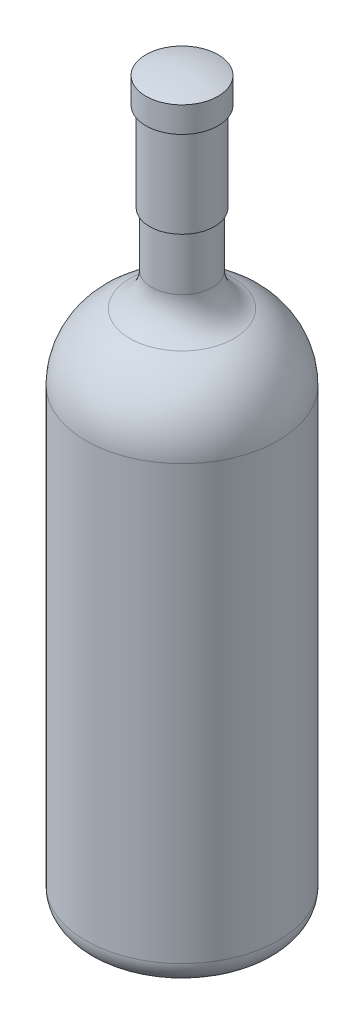
ISO-10303-21;
HEADER;
FILE_DESCRIPTION(('STEP AP214'),'2;1');
FILE_NAME('part.step','',(''),(''),'','','');
FILE_SCHEMA(('AUTOMOTIVE_DESIGN { 1 0 10303 214 1 1 1 1 }'));
ENDSEC;
DATA;
#1=APPLICATION_CONTEXT('core data for automotive mechanical design processes');
#2=APPLICATION_PROTOCOL_DEFINITION('international standard','automotive_design',2000,#1);
#3=PRODUCT_CONTEXT('',#1,'mechanical');
#4=PRODUCT('Part','Part','',(#3));
#5=PRODUCT_RELATED_PRODUCT_CATEGORY('part','',(#4));
#6=PRODUCT_DEFINITION_FORMATION('','',#4);
#7=PRODUCT_DEFINITION_CONTEXT('part definition',#1,'design');
#8=PRODUCT_DEFINITION('design','',#6,#7);
#9=PRODUCT_DEFINITION_SHAPE('','',#8);
#10=(LENGTH_UNIT() NAMED_UNIT(*) SI_UNIT(.MILLI.,.METRE.));
#11=(NAMED_UNIT(*) PLANE_ANGLE_UNIT() SI_UNIT($,.RADIAN.));
#12=(NAMED_UNIT(*) SI_UNIT($,.STERADIAN.) SOLID_ANGLE_UNIT());
#13=UNCERTAINTY_MEASURE_WITH_UNIT(LENGTH_MEASURE(1.E-05),#10,'distance_accuracy_value','');
#14=(GEOMETRIC_REPRESENTATION_CONTEXT(3) GLOBAL_UNCERTAINTY_ASSIGNED_CONTEXT((#13)) GLOBAL_UNIT_ASSIGNED_CONTEXT((#10,
#11,#12)) REPRESENTATION_CONTEXT('',''));
#15=CARTESIAN_POINT('',(0.,0.,0.));
#16=DIRECTION('',(0.,0.,1.));
#17=DIRECTION('',(1.,0.,0.));
#18=AXIS2_PLACEMENT_3D('',#15,#16,#17);
#19=CARTESIAN_POINT('',(0.,25.,0.));
#20=CARTESIAN_POINT('',(15.4953746740138,25.,0.));
#21=CARTESIAN_POINT('',(19.2023142455503,0.,0.));
#22=CARTESIAN_POINT('',(29.8048549239684,0.,0.));
#23=CARTESIAN_POINT('',(29.9098305742498,0.,0.));
#24=CARTESIAN_POINT('',(30.0148062245311,0.,0.));
#25=B_SPLINE_CURVE_WITH_KNOTS('',3,(#19,#20,#21,#22,#23,#24),.UNSPECIFIED.,.F.,.F.,(4,2,4),(0.,
1.,1.01),.UNSPECIFIED.);
#26=CARTESIAN_POINT('',(0.,0.,0.));
#27=DIRECTION('',(0.,-1.,0.));
#28=AXIS1_PLACEMENT('',#26,#27);
#29=SURFACE_OF_REVOLUTION('',#25,#28);
#30=OFFSET_SURFACE('',#29,2.2,.F.);
#31=CARTESIAN_POINT('',(0.,2.2,0.));
#32=DIRECTION('',(0.,-1.,0.));
#33=DIRECTION('',(0.,0.,-1.));
#34=AXIS2_PLACEMENT_3D('',#31,#32,#33);
#35=CIRCLE('',#34,29.7349489726552);
#36=CARTESIAN_POINT('',(0.,2.2,-29.7349489726552));
#37=VERTEX_POINT('',#36);
#38=EDGE_CURVE('E78',#37,#37,#35,.T.);
#39=ORIENTED_EDGE('',*,*,#38,.T.);
#40=EDGE_LOOP('',(#39));
#41=FACE_BOUND('',#40,.T.);
#42=CARTESIAN_POINT('',(0.,27.2,0.));
#43=VERTEX_POINT('',#42);
#44=VERTEX_LOOP('',#43);
#45=FACE_BOUND('',#44,.T.);
#46=ADVANCED_FACE('F46',(#41,#45),#30,.F.);
#47=CARTESIAN_POINT('',(0.,9.9954953628941,0.));
#48=DIRECTION('',(0.,-1.,0.));
#49=DIRECTION('',(0.,0.,-1.));
#50=AXIS2_PLACEMENT_3D('',#47,#48,#49);
#51=TOROIDAL_SURFACE('',#50,30.,7.8);
#52=CARTESIAN_POINT('',(0.,9.9954953628941,0.));
#53=DIRECTION('',(0.,-1.,0.));
#54=DIRECTION('',(0.,0.,-1.));
#55=AXIS2_PLACEMENT_3D('',#52,#53,#54);
#56=CIRCLE('',#55,37.8);
#57=CARTESIAN_POINT('',(0.,9.9954953628941,-37.8));
#58=VERTEX_POINT('',#57);
#59=EDGE_CURVE('E99',#58,#58,#56,.T.);
#60=ORIENTED_EDGE('',*,*,#59,.T.);
#61=EDGE_LOOP('',(#60));
#62=FACE_BOUND('',#61,.T.);
#63=ORIENTED_EDGE('',*,*,#38,.F.);
#64=EDGE_LOOP('',(#63));
#65=FACE_BOUND('',#64,.T.);
#66=ADVANCED_FACE('F57',(#62,#65),#51,.T.);
#67=CARTESIAN_POINT('',(0.,0.,0.));
#68=DIRECTION('',(0.,-1.,0.));
#69=DIRECTION('',(0.,0.,-1.));
#70=AXIS2_PLACEMENT_3D('',#67,#68,#69);
#71=CYLINDRICAL_SURFACE('',#70,37.8);
#72=CARTESIAN_POINT('',(0.,190.104348142246,0.));
#73=DIRECTION('',(0.,-1.,0.));
#74=DIRECTION('',(0.,0.,-1.));
#75=AXIS2_PLACEMENT_3D('',#72,#73,#74);
#76=CIRCLE('',#75,37.8);
#77=CARTESIAN_POINT('',(0.,190.104348142246,-37.8));
#78=VERTEX_POINT('',#77);
#79=EDGE_CURVE('E97',#78,#78,#76,.T.);
#80=ORIENTED_EDGE('',*,*,#79,.T.);
#81=EDGE_LOOP('',(#80));
#82=FACE_BOUND('',#81,.T.);
#83=ORIENTED_EDGE('',*,*,#59,.F.);
#84=EDGE_LOOP('',(#83));
#85=FACE_BOUND('',#84,.T.);
#86=ADVANCED_FACE('F63',(#82,#85),#71,.T.);
#87=CARTESIAN_POINT('',(0.,190.104348142246,0.));
#88=DIRECTION('',(0.,-1.,0.));
#89=DIRECTION('',(0.,0.,-1.));
#90=AXIS2_PLACEMENT_3D('',#87,#88,#89);
#91=DEGENERATE_TOROIDAL_SURFACE('',#90,9.99999999999997,27.8,.T.);
#92=CARTESIAN_POINT('',(0.,215.716061801102,0.));
#93=DIRECTION('',(0.,-1.,0.));
#94=DIRECTION('',(0.,0.,-1.));
#95=AXIS2_PLACEMENT_3D('',#92,#93,#94);
#96=CIRCLE('',#95,20.8111111111111);
#97=CARTESIAN_POINT('',(0.,215.716061801102,-20.8111111111111));
#98=VERTEX_POINT('',#97);
#99=EDGE_CURVE('E88',#98,#98,#96,.T.);
#100=ORIENTED_EDGE('',*,*,#99,.T.);
#101=EDGE_LOOP('',(#100));
#102=FACE_BOUND('',#101,.T.);
#103=ORIENTED_EDGE('',*,*,#79,.F.);
#104=EDGE_LOOP('',(#103));
#105=FACE_BOUND('',#104,.T.);
#106=ADVANCED_FACE('F106',(#102,#105),#91,.T.);
#107=CARTESIAN_POINT('',(0.,231.562158021689,0.));
#108=DIRECTION('',(0.,-1.,0.));
#109=DIRECTION('',(0.,0.,-1.));
#110=AXIS2_PLACEMENT_3D('',#107,#108,#109);
#111=TOROIDAL_SURFACE('',#110,27.5,17.2);
#112=CARTESIAN_POINT('',(0.,231.562158021689,0.));
#113=DIRECTION('',(0.,-1.,0.));
#114=DIRECTION('',(0.,0.,-1.));
#115=AXIS2_PLACEMENT_3D('',#112,#113,#114);
#116=CIRCLE('',#115,10.3);
#117=CARTESIAN_POINT('',(0.,231.562158021689,-10.3));
#118=VERTEX_POINT('',#117);
#119=EDGE_CURVE('E84',#118,#118,#116,.F.);
#120=ORIENTED_EDGE('',*,*,#119,.F.);
#121=EDGE_LOOP('',(#120));
#122=FACE_BOUND('',#121,.T.);
#123=ORIENTED_EDGE('',*,*,#99,.F.);
#124=EDGE_LOOP('',(#123));
#125=FACE_BOUND('',#124,.T.);
#126=ADVANCED_FACE('F69',(#122,#125),#111,.F.);
#127=CARTESIAN_POINT('',(0.,0.,0.));
#128=DIRECTION('',(0.,-1.,0.));
#129=DIRECTION('',(0.,0.,-1.));
#130=AXIS2_PLACEMENT_3D('',#127,#128,#129);
#131=CYLINDRICAL_SURFACE('',#130,10.3);
#132=CARTESIAN_POINT('',(0.,236.279188337744,0.));
#133=DIRECTION('',(0.,1.,0.));
#134=DIRECTION('',(0.,0.,1.));
#135=AXIS2_PLACEMENT_3D('',#132,#133,#134);
#136=CIRCLE('',#135,10.3);
#137=CARTESIAN_POINT('',(0.,236.279188337744,10.3));
#138=VERTEX_POINT('',#137);
#139=EDGE_CURVE('E95',#138,#138,#136,.T.);
#140=ORIENTED_EDGE('',*,*,#139,.F.);
#141=EDGE_LOOP('',(#140));
#142=FACE_BOUND('',#141,.T.);
#143=ORIENTED_EDGE('',*,*,#119,.T.);
#144=EDGE_LOOP('',(#143));
#145=FACE_BOUND('',#144,.T.);
#146=ADVANCED_FACE('F117',(#142,#145),#131,.T.);
#147=CARTESIAN_POINT('',(0.,236.279188337744,0.));
#148=DIRECTION('',(0.,1.,0.));
#149=DIRECTION('',(0.,0.,1.));
#150=AXIS2_PLACEMENT_3D('',#147,#148,#149);
#151=CONICAL_SURFACE('',#150,10.3,0.471238898038469);
#152=CARTESIAN_POINT('',(0.,236.052193087874,0.));
#153=DIRECTION('',(0.,-1.,0.));
#154=DIRECTION('',(0.,0.,-1.));
#155=AXIS2_PLACEMENT_3D('',#152,#153,#154);
#156=CIRCLE('',#155,10.184340143277);
#157=CARTESIAN_POINT('',(0.,236.052193087874,-10.184340143277));
#158=VERTEX_POINT('',#157);
#159=EDGE_CURVE('E13',#158,#158,#156,.T.);
#160=ORIENTED_EDGE('',*,*,#159,.T.);
#161=EDGE_LOOP('',(#160));
#162=FACE_BOUND('',#161,.T.);
#163=ORIENTED_EDGE('',*,*,#139,.T.);
#164=EDGE_LOOP('',(#163));
#165=FACE_BOUND('',#164,.T.);
#166=ADVANCED_FACE('F124',(#162,#165),#151,.F.);
#167=CARTESIAN_POINT('',(0.,235.779188337744,0.));
#168=DIRECTION('',(0.,1.,0.));
#169=DIRECTION('',(0.,0.,1.));
#170=AXIS2_PLACEMENT_3D('',#167,#168,#169);
#171=PLANE('',#170);
#172=CARTESIAN_POINT('',(0.,235.779188337744,0.));
#173=DIRECTION('',(0.,1.,0.));
#174=DIRECTION('',(0.,0.,1.));
#175=AXIS2_PLACEMENT_3D('',#172,#173,#174);
#176=CIRCLE('',#175,9.73883688118282);
#177=CARTESIAN_POINT('',(0.,235.779188337744,9.73883688118282));
#178=VERTEX_POINT('',#177);
#179=EDGE_CURVE('E53',#178,#178,#176,.T.);
#180=ORIENTED_EDGE('',*,*,#179,.T.);
#181=EDGE_LOOP('',(#180));
#182=FACE_BOUND('',#181,.T.);
#183=ADVANCED_FACE('F129',(#182),#171,.T.);
#184=CARTESIAN_POINT('',(0.,236.279188337744,0.));
#185=DIRECTION('',(0.,1.,0.));
#186=DIRECTION('',(0.,0.,1.));
#187=AXIS2_PLACEMENT_3D('',#184,#185,#186);
#188=TOROIDAL_SURFACE('',#187,9.73883688118282,0.5);
#189=ORIENTED_EDGE('',*,*,#159,.F.);
#190=EDGE_LOOP('',(#189));
#191=FACE_BOUND('',#190,.T.);
#192=ORIENTED_EDGE('',*,*,#179,.F.);
#193=EDGE_LOOP('',(#192));
#194=FACE_BOUND('',#193,.T.);
#195=ADVANCED_FACE('F48',(#191,#194),#188,.F.);
#196=CLOSED_SHELL('',(#46,#66,#86,#106,#126,#146,#166,#183,#195));
#197=MANIFOLD_SOLID_BREP('B2',#196);
#198=CARTESIAN_POINT('',(0.,254.,0.));
#199=DIRECTION('',(0.,-1.,0.));
#200=DIRECTION('',(1.,0.,0.));
#201=AXIS2_PLACEMENT_3D('',#198,#199,#200);
#202=SPHERICAL_SURFACE('',#201,50.);
#203=CARTESIAN_POINT('',(0.,301.696960070847,0.));
#204=DIRECTION('',(0.,-1.,0.));
#205=DIRECTION('',(0.,0.,-1.));
#206=AXIS2_PLACEMENT_3D('',#203,#204,#205);
#207=CIRCLE('',#206,15.);
#208=CARTESIAN_POINT('',(0.,301.696960070847,-15.));
#209=VERTEX_POINT('',#208);
#210=EDGE_CURVE('E45',#209,#209,#207,.T.);
#211=ORIENTED_EDGE('',*,*,#210,.F.);
#212=EDGE_LOOP('',(#211));
#213=FACE_BOUND('',#212,.T.);
#214=ADVANCED_FACE('F202',(#213),#202,.T.);
#215=CARTESIAN_POINT('',(0.,0.,0.));
#216=DIRECTION('',(0.,-1.,0.));
#217=DIRECTION('',(0.,0.,-1.));
#218=AXIS2_PLACEMENT_3D('',#215,#216,#217);
#219=CYLINDRICAL_SURFACE('',#218,15.);
#220=ORIENTED_EDGE('',*,*,#210,.T.);
#221=EDGE_LOOP('',(#220));
#222=FACE_BOUND('',#221,.T.);
#223=CARTESIAN_POINT('',(0.,291.032263350094,0.));
#224=DIRECTION('',(0.,-1.,0.));
#225=DIRECTION('',(0.,0.,-1.));
#226=AXIS2_PLACEMENT_3D('',#223,#224,#225);
#227=CIRCLE('',#226,15.);
#228=CARTESIAN_POINT('',(0.,291.032263350094,-15.));
#229=VERTEX_POINT('',#228);
#230=EDGE_CURVE('E208',#229,#229,#227,.T.);
#231=ORIENTED_EDGE('',*,*,#230,.F.);
#232=EDGE_LOOP('',(#231));
#233=FACE_BOUND('',#232,.T.);
#234=ADVANCED_FACE('F244',(#222,#233),#219,.T.);
#235=CARTESIAN_POINT('',(0.,290.,0.));
#236=DIRECTION('',(0.,1.,0.));
#237=DIRECTION('',(0.,0.,1.));
#238=AXIS2_PLACEMENT_3D('',#235,#236,#237);
#239=CONICAL_SURFACE('',#238,13.4982347343008,0.968599541335774);
#240=ORIENTED_EDGE('',*,*,#230,.T.);
#241=EDGE_LOOP('',(#240));
#242=FACE_BOUND('',#241,.T.);
#243=CARTESIAN_POINT('',(0.,290.,0.));
#244=DIRECTION('',(0.,-1.,0.));
#245=DIRECTION('',(0.,0.,-1.));
#246=AXIS2_PLACEMENT_3D('',#243,#244,#245);
#247=CIRCLE('',#246,13.4982347343008);
#248=CARTESIAN_POINT('',(0.,290.,-13.4982347343008));
#249=VERTEX_POINT('',#248);
#250=EDGE_CURVE('E212',#249,#249,#247,.T.);
#251=ORIENTED_EDGE('',*,*,#250,.F.);
#252=EDGE_LOOP('',(#251));
#253=FACE_BOUND('',#252,.T.);
#254=ADVANCED_FACE('F249',(#242,#253),#239,.T.);
#255=CARTESIAN_POINT('',(0.,0.,0.));
#256=DIRECTION('',(0.,-1.,0.));
#257=DIRECTION('',(0.,0.,-1.));
#258=AXIS2_PLACEMENT_3D('',#255,#256,#257);
#259=CYLINDRICAL_SURFACE('',#258,13.4982347343008);
#260=ORIENTED_EDGE('',*,*,#250,.T.);
#261=EDGE_LOOP('',(#260));
#262=FACE_BOUND('',#261,.T.);
#263=CARTESIAN_POINT('',(0.,254.,0.));
#264=DIRECTION('',(0.,-1.,0.));
#265=DIRECTION('',(0.,0.,-1.));
#266=AXIS2_PLACEMENT_3D('',#263,#264,#265);
#267=CIRCLE('',#266,13.4982347343008);
#268=CARTESIAN_POINT('',(0.,254.,-13.4982347343008));
#269=VERTEX_POINT('',#268);
#270=EDGE_CURVE('E216',#269,#269,#267,.T.);
#271=ORIENTED_EDGE('',*,*,#270,.F.);
#272=EDGE_LOOP('',(#271));
#273=FACE_BOUND('',#272,.T.);
#274=ADVANCED_FACE('F240',(#262,#273),#259,.T.);
#275=CARTESIAN_POINT('',(13.4982347343008,254.,0.));
#276=DIRECTION('',(0.,-1.,0.));
#277=DIRECTION('',(0.,0.,-1.));
#278=AXIS2_PLACEMENT_3D('',#275,#276,#277);
#279=PLANE('',#278);
#280=ORIENTED_EDGE('',*,*,#270,.T.);
#281=EDGE_LOOP('',(#280));
#282=FACE_BOUND('',#281,.T.);
#283=CARTESIAN_POINT('',(0.,254.,0.));
#284=DIRECTION('',(0.,-1.,0.));
#285=DIRECTION('',(0.,0.,-1.));
#286=AXIS2_PLACEMENT_3D('',#283,#284,#285);
#287=CIRCLE('',#286,12.5);
#288=CARTESIAN_POINT('',(0.,254.,-12.5));
#289=VERTEX_POINT('',#288);
#290=EDGE_CURVE('E221',#289,#289,#287,.T.);
#291=ORIENTED_EDGE('',*,*,#290,.F.);
#292=EDGE_LOOP('',(#291));
#293=FACE_BOUND('',#292,.T.);
#294=ADVANCED_FACE('F232',(#282,#293),#279,.T.);
#295=CARTESIAN_POINT('',(0.,0.,0.));
#296=DIRECTION('',(0.,-1.,0.));
#297=DIRECTION('',(0.,0.,-1.));
#298=AXIS2_PLACEMENT_3D('',#295,#296,#297);
#299=CYLINDRICAL_SURFACE('',#298,12.5);
#300=ORIENTED_EDGE('',*,*,#290,.T.);
#301=EDGE_LOOP('',(#300));
#302=FACE_BOUND('',#301,.T.);
#303=CARTESIAN_POINT('',(0.,300.,0.));
#304=DIRECTION('',(0.,-1.,0.));
#305=DIRECTION('',(0.,0.,-1.));
#306=AXIS2_PLACEMENT_3D('',#303,#304,#305);
#307=CIRCLE('',#306,12.5);
#308=CARTESIAN_POINT('',(0.,300.,-12.5));
#309=VERTEX_POINT('',#308);
#310=EDGE_CURVE('E224',#309,#309,#307,.T.);
#311=ORIENTED_EDGE('',*,*,#310,.F.);
#312=EDGE_LOOP('',(#311));
#313=FACE_BOUND('',#312,.T.);
#314=ADVANCED_FACE('F230',(#302,#313),#299,.F.);
#315=CARTESIAN_POINT('',(12.5,300.,0.));
#316=DIRECTION('',(0.,-1.,0.));
#317=DIRECTION('',(0.,0.,-1.));
#318=AXIS2_PLACEMENT_3D('',#315,#316,#317);
#319=PLANE('',#318);
#320=ORIENTED_EDGE('',*,*,#310,.T.);
#321=EDGE_LOOP('',(#320));
#322=FACE_BOUND('',#321,.T.);
#323=ADVANCED_FACE('F228',(#322),#319,.T.);
#324=CLOSED_SHELL('',(#214,#234,#254,#274,#294,#314,#323));
#325=MANIFOLD_SOLID_BREP('B7',#324);
#326=CARTESIAN_POINT('',(12.5,300.,0.));
#327=DIRECTION('',(0.,1.,0.));
#328=DIRECTION('',(0.,0.,1.));
#329=AXIS2_PLACEMENT_3D('',#326,#327,#328);
#330=PLANE('',#329);
#331=CARTESIAN_POINT('',(0.,300.,0.));
#332=DIRECTION('',(0.,-1.,0.));
#333=DIRECTION('',(0.,0.,-1.));
#334=AXIS2_PLACEMENT_3D('',#331,#332,#333);
#335=CIRCLE('',#334,12.5);
#336=CARTESIAN_POINT('',(0.,300.,-12.5));
#337=VERTEX_POINT('',#336);
#338=EDGE_CURVE('E376',#337,#337,#335,.T.);
#339=ORIENTED_EDGE('',*,*,#338,.F.);
#340=EDGE_LOOP('',(#339));
#341=FACE_BOUND('',#340,.T.);
#342=CARTESIAN_POINT('',(0.,300.,0.));
#343=DIRECTION('',(0.,1.,0.));
#344=DIRECTION('',(0.,0.,1.));
#345=AXIS2_PLACEMENT_3D('',#342,#343,#344);
#346=CIRCLE('',#345,10.5);
#347=CARTESIAN_POINT('',(0.,300.,10.5));
#348=VERTEX_POINT('',#347);
#349=EDGE_CURVE('E412',#348,#348,#346,.F.);
#350=ORIENTED_EDGE('',*,*,#349,.T.);
#351=EDGE_LOOP('',(#350));
#352=FACE_BOUND('',#351,.T.);
#353=ADVANCED_FACE('F302',(#341,#352),#330,.T.);
#354=CARTESIAN_POINT('',(0.,25.,0.));
#355=CARTESIAN_POINT('',(15.4953746740138,25.,0.));
#356=CARTESIAN_POINT('',(19.2023142455503,0.,0.));
#357=CARTESIAN_POINT('',(29.699879273687,0.,0.));
#358=CARTESIAN_POINT('',(29.8048549239684,0.,0.));
#359=CARTESIAN_POINT('',(29.9098305742498,0.,0.));
#360=CARTESIAN_POINT('',(30.0148062245311,0.,0.));
#361=B_SPLINE_CURVE_WITH_KNOTS('',3,(#354,#355,#356,#357,#358,#359,#360),.UNSPECIFIED.,.F.,.F.,
(4,3,4),(0.,1.,1.01),.UNSPECIFIED.);
#362=CARTESIAN_POINT('',(0.,0.,0.));
#363=DIRECTION('',(0.,-1.,0.));
#364=AXIS1_PLACEMENT('',#362,#363);
#365=SURFACE_OF_REVOLUTION('',#361,#364);
#366=CARTESIAN_POINT('',(0.,0.,0.));
#367=DIRECTION('',(0.,-1.,0.));
#368=DIRECTION('',(0.,0.,-1.));
#369=AXIS2_PLACEMENT_3D('',#366,#367,#368);
#370=CIRCLE('',#369,29.699879273687);
#371=CARTESIAN_POINT('',(0.,0.,-29.699879273687));
#372=VERTEX_POINT('',#371);
#373=EDGE_CURVE('E368',#372,#372,#370,.T.);
#374=ORIENTED_EDGE('',*,*,#373,.T.);
#375=EDGE_LOOP('',(#374));
#376=FACE_BOUND('',#375,.T.);
#377=CARTESIAN_POINT('',(0.,25.,0.));
#378=VERTEX_POINT('',#377);
#379=VERTEX_LOOP('',#378);
#380=FACE_BOUND('',#379,.T.);
#381=ADVANCED_FACE('F334',(#376,#380),#365,.F.);
#382=CARTESIAN_POINT('',(0.,9.9954953628941,0.));
#383=DIRECTION('',(0.,-1.,0.));
#384=DIRECTION('',(0.,0.,-1.));
#385=AXIS2_PLACEMENT_3D('',#382,#383,#384);
#386=TOROIDAL_SURFACE('',#385,30.,9.99999999999999);
#387=CARTESIAN_POINT('',(0.,9.9954953628941,0.));
#388=DIRECTION('',(0.,-1.,0.));
#389=DIRECTION('',(0.,0.,-1.));
#390=AXIS2_PLACEMENT_3D('',#387,#388,#389);
#391=CIRCLE('',#390,40.);
#392=CARTESIAN_POINT('',(0.,9.9954953628941,-40.));
#393=VERTEX_POINT('',#392);
#394=EDGE_CURVE('E365',#393,#393,#391,.T.);
#395=ORIENTED_EDGE('',*,*,#394,.T.);
#396=EDGE_LOOP('',(#395));
#397=FACE_BOUND('',#396,.T.);
#398=ORIENTED_EDGE('',*,*,#373,.F.);
#399=EDGE_LOOP('',(#398));
#400=FACE_BOUND('',#399,.T.);
#401=ADVANCED_FACE('F340',(#397,#400),#386,.T.);
#402=CARTESIAN_POINT('',(0.,0.,0.));
#403=DIRECTION('',(0.,-1.,0.));
#404=DIRECTION('',(0.,0.,-1.));
#405=AXIS2_PLACEMENT_3D('',#402,#403,#404);
#406=CYLINDRICAL_SURFACE('',#405,40.);
#407=CARTESIAN_POINT('',(0.,190.104348142246,0.));
#408=DIRECTION('',(0.,-1.,0.));
#409=DIRECTION('',(0.,0.,-1.));
#410=AXIS2_PLACEMENT_3D('',#407,#408,#409);
#411=CIRCLE('',#410,40.);
#412=CARTESIAN_POINT('',(0.,190.104348142246,-40.));
#413=VERTEX_POINT('',#412);
#414=EDGE_CURVE('E371',#413,#413,#411,.T.);
#415=ORIENTED_EDGE('',*,*,#414,.T.);
#416=EDGE_LOOP('',(#415));
#417=FACE_BOUND('',#416,.T.);
#418=ORIENTED_EDGE('',*,*,#394,.F.);
#419=EDGE_LOOP('',(#418));
#420=FACE_BOUND('',#419,.T.);
#421=ADVANCED_FACE('F354',(#417,#420),#406,.T.);
#422=CARTESIAN_POINT('',(0.,190.104348142246,0.));
#423=DIRECTION('',(0.,-1.,0.));
#424=DIRECTION('',(0.,0.,-1.));
#425=AXIS2_PLACEMENT_3D('',#422,#423,#424);
#426=DEGENERATE_TOROIDAL_SURFACE('',#425,9.99999999999997,30.,.T.);
#427=CARTESIAN_POINT('',(0.,217.742888061875,0.));
#428=DIRECTION('',(0.,-1.,0.));
#429=DIRECTION('',(0.,0.,-1.));
#430=AXIS2_PLACEMENT_3D('',#427,#428,#429);
#431=CIRCLE('',#430,21.6666666666667);
#432=CARTESIAN_POINT('',(0.,217.742888061875,-21.6666666666667));
#433=VERTEX_POINT('',#432);
#434=EDGE_CURVE('E310',#433,#433,#431,.T.);
#435=ORIENTED_EDGE('',*,*,#434,.T.);
#436=EDGE_LOOP('',(#435));
#437=FACE_BOUND('',#436,.T.);
#438=ORIENTED_EDGE('',*,*,#414,.F.);
#439=EDGE_LOOP('',(#438));
#440=FACE_BOUND('',#439,.T.);
#441=ADVANCED_FACE('F350',(#437,#440),#426,.T.);
#442=CARTESIAN_POINT('',(0.,0.,0.));
#443=DIRECTION('',(0.,-1.,0.));
#444=DIRECTION('',(0.,0.,-1.));
#445=AXIS2_PLACEMENT_3D('',#442,#443,#444);
#446=CYLINDRICAL_SURFACE('',#445,12.5);
#447=CARTESIAN_POINT('',(0.,231.562158021689,0.));
#448=DIRECTION('',(0.,-1.,0.));
#449=DIRECTION('',(0.,0.,-1.));
#450=AXIS2_PLACEMENT_3D('',#447,#448,#449);
#451=CIRCLE('',#450,12.5);
#452=CARTESIAN_POINT('',(0.,231.562158021689,-12.5));
#453=VERTEX_POINT('',#452);
#454=EDGE_CURVE('E200',#453,#453,#451,.F.);
#455=ORIENTED_EDGE('',*,*,#454,.T.);
#456=EDGE_LOOP('',(#455));
#457=FACE_BOUND('',#456,.T.);
#458=ORIENTED_EDGE('',*,*,#338,.T.);
#459=EDGE_LOOP('',(#458));
#460=FACE_BOUND('',#459,.T.);
#461=ADVANCED_FACE('F328',(#457,#460),#446,.T.);
#462=CARTESIAN_POINT('',(0.,231.562158021689,0.));
#463=DIRECTION('',(0.,-1.,0.));
#464=DIRECTION('',(0.,0.,-1.));
#465=AXIS2_PLACEMENT_3D('',#462,#463,#464);
#466=TOROIDAL_SURFACE('',#465,27.5,15.);
#467=ORIENTED_EDGE('',*,*,#454,.F.);
#468=EDGE_LOOP('',(#467));
#469=FACE_BOUND('',#468,.T.);
#470=ORIENTED_EDGE('',*,*,#434,.F.);
#471=EDGE_LOOP('',(#470));
#472=FACE_BOUND('',#471,.T.);
#473=ADVANCED_FACE('F304',(#469,#472),#466,.F.);
#474=CARTESIAN_POINT('',(0.,25.,0.));
#475=CARTESIAN_POINT('',(15.4953746740138,25.,0.));
#476=CARTESIAN_POINT('',(19.2023142455503,0.,0.));
#477=CARTESIAN_POINT('',(29.8048549239684,0.,0.));
#478=CARTESIAN_POINT('',(29.9098305742498,0.,0.));
#479=CARTESIAN_POINT('',(30.0148062245311,0.,0.));
#480=B_SPLINE_CURVE_WITH_KNOTS('',3,(#474,#475,#476,#477,#478,#479),.UNSPECIFIED.,.F.,.F.,(4,2,
4),(0.,1.,1.01),.UNSPECIFIED.);
#481=CARTESIAN_POINT('',(0.,0.,0.));
#482=DIRECTION('',(0.,-1.,0.));
#483=AXIS1_PLACEMENT('',#481,#482);
#484=SURFACE_OF_REVOLUTION('',#480,#483);
#485=OFFSET_SURFACE('',#484,2.,.F.);
#486=CARTESIAN_POINT('',(0.,2.,-29.7315714211585));
#487=CARTESIAN_POINT('',(-0.486482191040812,2.,-29.7315817406532));
#488=CARTESIAN_POINT('',(-0.972963503993751,2.,-29.7196317312335));
#489=CARTESIAN_POINT('',(-1.94475462347781,2.,-29.6718851513519));
#490=CARTESIAN_POINT('',(-2.43006443000892,2.,-29.63608858089));
#491=CARTESIAN_POINT('',(-3.3983427864032,2.,-29.540722975711));
#492=CARTESIAN_POINT('',(-3.88131133626636,2.,-29.4811539409938));
#493=CARTESIAN_POINT('',(-4.84374382559375,2.,-29.3383901673065));
#494=CARTESIAN_POINT('',(-5.32320776505798,2.,-29.2551954283364));
#495=CARTESIAN_POINT('',(-6.27747592014065,2.,-29.0653797979228));
#496=CARTESIAN_POINT('',(-6.7522801357591,2.,-28.9587589064795));
#497=CARTESIAN_POINT('',(-7.69608500968057,2.,-28.7223480637394));
#498=CARTESIAN_POINT('',(-8.16508566798359,2.,-28.5925581124427));
#499=CARTESIAN_POINT('',(-9.0961535605344,2.,-28.3101217627764));
#500=CARTESIAN_POINT('',(-9.55822079478218,2.,-28.1574753644068));
#501=CARTESIAN_POINT('',(-10.4743086796067,2.,-27.829693875907));
#502=CARTESIAN_POINT('',(-10.9283293301834,2.,-27.6545587857768));
#503=CARTESIAN_POINT('',(-11.8272302719302,2.,-27.2822218250349));
#504=CARTESIAN_POINT('',(-12.2721105631003,2.,-27.0850199544232));
#505=CARTESIAN_POINT('',(-13.1516590305048,2.,-26.6690245105013));
#506=CARTESIAN_POINT('',(-13.5863272067391,2.,-26.4502309371911));
#507=CARTESIAN_POINT('',(-14.4444042905473,2.,-25.9915791804319));
#508=CARTESIAN_POINT('',(-14.867813198121,2.,-25.7517209969828));
#509=CARTESIAN_POINT('',(-15.7023517154676,2.,-25.2515178594053));
#510=CARTESIAN_POINT('',(-16.1134813252405,2.,-24.9911729052768));
#511=CARTESIAN_POINT('',(-16.9224707997435,2.,-24.4506234201153));
#512=CARTESIAN_POINT('',(-17.3203306644736,2.,-24.1704188890823));
#513=CARTESIAN_POINT('',(-18.1018221696289,2.,-23.5908252873761));
#514=CARTESIAN_POINT('',(-18.485453810054,2.,-23.291436216703));
#515=CARTESIAN_POINT('',(-19.2375646643754,2.,-22.6741947902096));
#516=CARTESIAN_POINT('',(-19.6060438782716,2.,-22.3563424343894));
#517=CARTESIAN_POINT('',(-20.3269621808338,2.,-21.702940171768));
#518=CARTESIAN_POINT('',(-20.6794012694998,2.,-21.3673902649669));
#519=CARTESIAN_POINT('',(-21.3673902649669,2.,-20.6794012694998));
#520=CARTESIAN_POINT('',(-21.7029401717681,2.,-20.3269621808338));
#521=CARTESIAN_POINT('',(-22.3563424343894,2.,-19.6060438782716));
#522=CARTESIAN_POINT('',(-22.6741947902095,2.,-19.2375646643754));
#523=CARTESIAN_POINT('',(-23.2914362167031,2.,-18.485453810054));
#524=CARTESIAN_POINT('',(-23.5908252873765,2.,-18.1018221696289));
#525=CARTESIAN_POINT('',(-24.1704188890819,2.,-17.3203306644735));
#526=CARTESIAN_POINT('',(-24.4506234201139,2.,-16.9224707997434));
#527=CARTESIAN_POINT('',(-24.9911729052783,2.,-16.1134813252406));
#528=CARTESIAN_POINT('',(-25.2515178594106,2.,-15.7023517154679));
#529=CARTESIAN_POINT('',(-25.7517209969776,2.,-14.8678131981208));
#530=CARTESIAN_POINT('',(-25.9915791804122,2.,-14.4444042905463));
#531=CARTESIAN_POINT('',(-26.4502309372108,2.,-13.5863272067401));
#532=CARTESIAN_POINT('',(-26.6690245105748,2.,-13.1516590305084));
#533=CARTESIAN_POINT('',(-27.0850199543497,2.,-12.2721105630967));
#534=CARTESIAN_POINT('',(-27.2822218247607,2.,-11.8272302719167));
#535=CARTESIAN_POINT('',(-27.654558786051,2.,-10.9283293301968));
#536=CARTESIAN_POINT('',(-27.8296938769303,2.,-10.4743086796569));
#537=CARTESIAN_POINT('',(-28.1574753633834,2.,-9.5582207947319));
#538=CARTESIAN_POINT('',(-28.3101217589572,2.,-9.09615356034677));
#539=CARTESIAN_POINT('',(-28.5925581162619,2.,-8.16508566817121));
#540=CARTESIAN_POINT('',(-28.7223480779929,2.,-7.69608501038078));
#541=CARTESIAN_POINT('',(-28.958758892226,2.,-6.75228013505886));
#542=CARTESIAN_POINT('',(-29.0653797447282,2.,-6.27747591752737));
#543=CARTESIAN_POINT('',(-29.255195481531,2.,-5.32320776767128));
#544=CARTESIAN_POINT('',(-29.3383903658318,2.,-4.84374383534669));
#545=CARTESIAN_POINT('',(-29.4811537424686,2.,-3.88131132651344));
#546=CARTESIAN_POINT('',(-29.5407222348046,2.,-3.39834275000478));
#547=CARTESIAN_POINT('',(-29.6360893217964,2.,-2.43006446640729));
#548=CARTESIAN_POINT('',(-29.6718879164521,2.,-1.94475475931846));
#549=CARTESIAN_POINT('',(-29.7196289661332,2.,-0.972963368153081));
#550=CARTESIAN_POINT('',(-29.7315714211585,2.,-0.486481684076532));
#551=CARTESIAN_POINT('',(-29.7315714211585,2.,0.486481684076557));
#552=CARTESIAN_POINT('',(-29.7196289661332,2.,0.972963368153097));
#553=CARTESIAN_POINT('',(-29.6718879164521,2.,1.94475475931847));
#554=CARTESIAN_POINT('',(-29.6360893217964,2.,2.4300644664073));
#555=CARTESIAN_POINT('',(-29.5407222348046,2.,3.39834275000479));
#556=CARTESIAN_POINT('',(-29.4811537424686,2.,3.88131132651344));
#557=CARTESIAN_POINT('',(-29.3383903658318,2.,4.8437438353467));
#558=CARTESIAN_POINT('',(-29.255195481531,2.,5.32320776767129));
#559=CARTESIAN_POINT('',(-29.0653797447282,2.,6.27747591752738));
#560=CARTESIAN_POINT('',(-28.958758892226,2.,6.75228013505887));
#561=CARTESIAN_POINT('',(-28.7223480779929,2.,7.69608501038079));
#562=CARTESIAN_POINT('',(-28.5925581162619,2.,8.16508566817122));
#563=CARTESIAN_POINT('',(-28.3101217589572,2.,9.09615356034678));
#564=CARTESIAN_POINT('',(-28.1574753633834,2.,9.5582207947319));
#565=CARTESIAN_POINT('',(-27.8296938769303,2.,10.4743086796569));
#566=CARTESIAN_POINT('',(-27.654558786051,2.,10.9283293301968));
#567=CARTESIAN_POINT('',(-27.2822218247607,2.,11.8272302719167));
#568=CARTESIAN_POINT('',(-27.0850199543497,2.,12.2721105630967));
#569=CARTESIAN_POINT('',(-26.6690245105748,2.,13.1516590305084));
#570=CARTESIAN_POINT('',(-26.4502309372108,2.,13.5863272067401));
#571=CARTESIAN_POINT('',(-25.9915791804122,2.,14.4444042905463));
#572=CARTESIAN_POINT('',(-25.7517209969776,2.,14.8678131981208));
#573=CARTESIAN_POINT('',(-25.2515178594106,2.,15.7023517154679));
#574=CARTESIAN_POINT('',(-24.9911729052783,2.,16.1134813252406));
#575=CARTESIAN_POINT('',(-24.4506234201139,2.,16.9224707997434));
#576=CARTESIAN_POINT('',(-24.1704188890819,2.,17.3203306644736));
#577=CARTESIAN_POINT('',(-23.5908252873765,2.,18.1018221696289));
#578=CARTESIAN_POINT('',(-23.2914362167031,2.,18.4854538100541));
#579=CARTESIAN_POINT('',(-22.6741947902095,2.,19.2375646643754));
#580=CARTESIAN_POINT('',(-22.3563424343894,2.,19.6060438782716));
#581=CARTESIAN_POINT('',(-21.7029401717681,2.,20.3269621808338));
#582=CARTESIAN_POINT('',(-21.3673902649669,2.,20.6794012694998));
#583=CARTESIAN_POINT('',(-20.6794012694997,2.,21.3673902649669));
#584=CARTESIAN_POINT('',(-20.3269621808338,2.,21.7029401717681));
#585=CARTESIAN_POINT('',(-19.6060438782716,2.,22.3563424343894));
#586=CARTESIAN_POINT('',(-19.2375646643754,2.,22.6741947902095));
#587=CARTESIAN_POINT('',(-18.4854538100541,2.,23.2914362167031));
#588=CARTESIAN_POINT('',(-18.1018221696289,2.,23.5908252873765));
#589=CARTESIAN_POINT('',(-17.3203306644736,2.,24.1704188890819));
#590=CARTESIAN_POINT('',(-16.9224707997434,2.,24.4506234201139));
#591=CARTESIAN_POINT('',(-16.1134813252405,2.,24.9911729052783));
#592=CARTESIAN_POINT('',(-15.7023517154679,2.,25.2515178594106));
#593=CARTESIAN_POINT('',(-14.8678131981208,2.,25.7517209969776));
#594=CARTESIAN_POINT('',(-14.4444042905463,2.,25.9915791804122));
#595=CARTESIAN_POINT('',(-13.5863272067401,2.,26.4502309372108));
#596=CARTESIAN_POINT('',(-13.1516590305084,2.,26.6690245105748));
#597=CARTESIAN_POINT('',(-12.2721105630967,2.,27.0850199543497));
#598=CARTESIAN_POINT('',(-11.8272302719167,2.,27.2822218247607));
#599=CARTESIAN_POINT('',(-10.9283293301968,2.,27.654558786051));
#600=CARTESIAN_POINT('',(-10.4743086796569,2.,27.8296938769303));
#601=CARTESIAN_POINT('',(-9.5582207947319,2.,28.1574753633834));
#602=CARTESIAN_POINT('',(-9.09615356034677,2.,28.3101217589572));
#603=CARTESIAN_POINT('',(-8.16508566817121,2.,28.5925581162619));
#604=CARTESIAN_POINT('',(-7.69608501038079,2.,28.7223480779929));
#605=CARTESIAN_POINT('',(-6.75228013505886,2.,28.958758892226));
#606=CARTESIAN_POINT('',(-6.27747591752736,2.,29.0653797447282));
#607=CARTESIAN_POINT('',(-5.32320776767126,2.,29.255195481531));
#608=CARTESIAN_POINT('',(-4.84374383534666,2.,29.3383903658318));
#609=CARTESIAN_POINT('',(-3.88131132651343,2.,29.4811537424686));
#610=CARTESIAN_POINT('',(-3.39834275000479,2.,29.5407222348046));
#611=CARTESIAN_POINT('',(-2.43006446640731,2.,29.6360893217964));
#612=CARTESIAN_POINT('',(-1.94475475931846,2.,29.6718879164521));
#613=CARTESIAN_POINT('',(-0.972963368153078,2.,29.7196289661332));
#614=CARTESIAN_POINT('',(-0.486481684076538,2.,29.7315714211585));
#615=CARTESIAN_POINT('',(0.486481684076542,2.,29.7315714211585));
#616=CARTESIAN_POINT('',(0.972963368153082,2.,29.7196289661332));
#617=CARTESIAN_POINT('',(1.94475475931847,2.,29.6718879164521));
#618=CARTESIAN_POINT('',(2.43006446640731,2.,29.6360893217964));
#619=CARTESIAN_POINT('',(3.3983427500048,2.,29.5407222348046));
#620=CARTESIAN_POINT('',(3.88131132651343,2.,29.4811537424686));
#621=CARTESIAN_POINT('',(4.84374383534667,2.,29.3383903658318));
#622=CARTESIAN_POINT('',(5.32320776767126,2.,29.255195481531));
#623=CARTESIAN_POINT('',(6.27747591752736,2.,29.0653797447282));
#624=CARTESIAN_POINT('',(6.75228013505886,2.,28.958758892226));
#625=CARTESIAN_POINT('',(7.69608501038079,2.,28.7223480779929));
#626=CARTESIAN_POINT('',(8.16508566817121,2.,28.5925581162619));
#627=CARTESIAN_POINT('',(9.09615356034677,2.,28.3101217589572));
#628=CARTESIAN_POINT('',(9.55822079473191,2.,28.1574753633834));
#629=CARTESIAN_POINT('',(10.4743086796569,2.,27.8296938769303));
#630=CARTESIAN_POINT('',(10.9283293301968,2.,27.654558786051));
#631=CARTESIAN_POINT('',(11.8272302719167,2.,27.2822218247607));
#632=CARTESIAN_POINT('',(12.2721105630967,2.,27.0850199543497));
#633=CARTESIAN_POINT('',(13.1516590305084,2.,26.6690245105748));
#634=CARTESIAN_POINT('',(13.5863272067401,2.,26.4502309372108));
#635=CARTESIAN_POINT('',(14.4444042905463,2.,25.9915791804122));
#636=CARTESIAN_POINT('',(14.8678131981208,2.,25.7517209969776));
#637=CARTESIAN_POINT('',(15.7023517154679,2.,25.2515178594106));
#638=CARTESIAN_POINT('',(16.1134813252406,2.,24.9911729052783));
#639=CARTESIAN_POINT('',(16.9224707997434,2.,24.4506234201139));
#640=CARTESIAN_POINT('',(17.3203306644736,2.,24.1704188890819));
#641=CARTESIAN_POINT('',(18.1018221696289,2.,23.5908252873765));
#642=CARTESIAN_POINT('',(18.4854538100541,2.,23.2914362167031));
#643=CARTESIAN_POINT('',(19.2375646643754,2.,22.6741947902095));
#644=CARTESIAN_POINT('',(19.6060438782716,2.,22.3563424343894));
#645=CARTESIAN_POINT('',(20.3269621808338,2.,21.7029401717681));
#646=CARTESIAN_POINT('',(20.6794012694997,2.,21.3673902649669));
#647=CARTESIAN_POINT('',(21.3673902649669,2.,20.6794012694998));
#648=CARTESIAN_POINT('',(21.7029401717681,2.,20.3269621808338));
#649=CARTESIAN_POINT('',(22.3563424343894,2.,19.6060438782716));
#650=CARTESIAN_POINT('',(22.6741947902095,2.,19.2375646643754));
#651=CARTESIAN_POINT('',(23.2914362167031,2.,18.485453810054));
#652=CARTESIAN_POINT('',(23.5908252873765,2.,18.1018221696289));
#653=CARTESIAN_POINT('',(24.1704188890819,2.,17.3203306644735));
#654=CARTESIAN_POINT('',(24.4506234201139,2.,16.9224707997434));
#655=CARTESIAN_POINT('',(24.9911729052783,2.,16.1134813252406));
#656=CARTESIAN_POINT('',(25.2515178594106,2.,15.7023517154679));
#657=CARTESIAN_POINT('',(25.7517209969776,2.,14.8678131981208));
#658=CARTESIAN_POINT('',(25.9915791804122,2.,14.4444042905463));
#659=CARTESIAN_POINT('',(26.4502309372108,2.,13.5863272067401));
#660=CARTESIAN_POINT('',(26.6690245105748,2.,13.1516590305084));
#661=CARTESIAN_POINT('',(27.0850199543497,2.,12.2721105630967));
#662=CARTESIAN_POINT('',(27.2822218247607,2.,11.8272302719167));
#663=CARTESIAN_POINT('',(27.654558786051,2.,10.9283293301968));
#664=CARTESIAN_POINT('',(27.8296938769303,2.,10.4743086796569));
#665=CARTESIAN_POINT('',(28.1574753633834,2.,9.55822079473189));
#666=CARTESIAN_POINT('',(28.3101217589572,2.,9.09615356034676));
#667=CARTESIAN_POINT('',(28.5925581162619,2.,8.16508566817122));
#668=CARTESIAN_POINT('',(28.7223480779929,2.,7.69608501038081));
#669=CARTESIAN_POINT('',(28.958758892226,2.,6.75228013505888));
#670=CARTESIAN_POINT('',(29.0653797447282,2.,6.27747591752737));
#671=CARTESIAN_POINT('',(29.255195481531,2.,5.32320776767126));
#672=CARTESIAN_POINT('',(29.3383903658318,2.,4.84374383534667));
#673=CARTESIAN_POINT('',(29.4811537424686,2.,3.88131132651342));
#674=CARTESIAN_POINT('',(29.5407222348046,2.,3.39834275000478));
#675=CARTESIAN_POINT('',(29.6360893217964,2.,2.43006446640729));
#676=CARTESIAN_POINT('',(29.6718879164521,2.,1.94475475931846));
#677=CARTESIAN_POINT('',(29.7196289661332,2.,0.97296336815308));
#678=CARTESIAN_POINT('',(29.7315714211585,2.,0.48648168407654));
#679=CARTESIAN_POINT('',(29.7315714211585,2.,-0.48648168407654));
#680=CARTESIAN_POINT('',(29.7196289661332,2.,-0.97296336815308));
#681=CARTESIAN_POINT('',(29.6718879164521,2.,-1.94475475931847));
#682=CARTESIAN_POINT('',(29.6360893217964,2.,-2.43006446640733));
#683=CARTESIAN_POINT('',(29.5407222348046,2.,-3.39834275000481));
#684=CARTESIAN_POINT('',(29.4811537424686,2.,-3.88131132651344));
#685=CARTESIAN_POINT('',(29.3383903658318,2.,-4.84374383534667));
#686=CARTESIAN_POINT('',(29.255195481531,2.,-5.32320776767126));
#687=CARTESIAN_POINT('',(29.0653797447282,2.,-6.27747591752735));
#688=CARTESIAN_POINT('',(28.958758892226,2.,-6.75228013505885));
#689=CARTESIAN_POINT('',(28.7223480779929,2.,-7.69608501038076));
#690=CARTESIAN_POINT('',(28.5925581162619,2.,-8.16508566817119));
#691=CARTESIAN_POINT('',(28.3101217589572,2.,-9.09615356034675));
#692=CARTESIAN_POINT('',(28.1574753633834,2.,-9.5582207947319));
#693=CARTESIAN_POINT('',(27.8296938769303,2.,-10.4743086796569));
#694=CARTESIAN_POINT('',(27.654558786051,2.,-10.9283293301968));
#695=CARTESIAN_POINT('',(27.2822218247607,2.,-11.8272302719167));
#696=CARTESIAN_POINT('',(27.0850199543497,2.,-12.2721105630967));
#697=CARTESIAN_POINT('',(26.6690245105748,2.,-13.1516590305084));
#698=CARTESIAN_POINT('',(26.4502309372108,2.,-13.5863272067401));
#699=CARTESIAN_POINT('',(25.9915791804122,2.,-14.4444042905463));
#700=CARTESIAN_POINT('',(25.7517209969776,2.,-14.8678131981208));
#701=CARTESIAN_POINT('',(25.2515178594106,2.,-15.7023517154679));
#702=CARTESIAN_POINT('',(24.9911729052783,2.,-16.1134813252406));
#703=CARTESIAN_POINT('',(24.4506234201139,2.,-16.9224707997434));
#704=CARTESIAN_POINT('',(24.1704188890819,2.,-17.3203306644736));
#705=CARTESIAN_POINT('',(23.5908252873765,2.,-18.1018221696289));
#706=CARTESIAN_POINT('',(23.2914362167031,2.,-18.4854538100541));
#707=CARTESIAN_POINT('',(22.6741947902095,2.,-19.2375646643754));
#708=CARTESIAN_POINT('',(22.3563424343894,2.,-19.6060438782716));
#709=CARTESIAN_POINT('',(21.7029401717681,2.,-20.3269621808337));
#710=CARTESIAN_POINT('',(21.3673902649669,2.,-20.6794012694997));
#711=CARTESIAN_POINT('',(20.6794012694998,2.,-21.3673902649669));
#712=CARTESIAN_POINT('',(20.3269621808338,2.,-21.702940171768));
#713=CARTESIAN_POINT('',(19.6060438782716,2.,-22.3563424343894));
#714=CARTESIAN_POINT('',(19.2375646643754,2.,-22.6741947902096));
#715=CARTESIAN_POINT('',(18.4854538100541,2.,-23.291436216703));
#716=CARTESIAN_POINT('',(18.1018221696289,2.,-23.5908252873761));
#717=CARTESIAN_POINT('',(17.3203306644736,2.,-24.1704188890823));
#718=CARTESIAN_POINT('',(16.9224707997434,2.,-24.4506234201153));
#719=CARTESIAN_POINT('',(16.1134813252405,2.,-24.9911729052768));
#720=CARTESIAN_POINT('',(15.7023517154676,2.,-25.2515178594053));
#721=CARTESIAN_POINT('',(14.867813198121,2.,-25.7517209969829));
#722=CARTESIAN_POINT('',(14.4444042905473,2.,-25.9915791804319));
#723=CARTESIAN_POINT('',(13.5863272067391,2.,-26.4502309371911));
#724=CARTESIAN_POINT('',(13.1516590305048,2.,-26.6690245105013));
#725=CARTESIAN_POINT('',(12.2721105631003,2.,-27.0850199544232));
#726=CARTESIAN_POINT('',(11.8272302719301,2.,-27.2822218250349));
#727=CARTESIAN_POINT('',(10.9283293301833,2.,-27.6545587857768));
#728=CARTESIAN_POINT('',(10.4743086796066,2.,-27.829693875907));
#729=CARTESIAN_POINT('',(9.55822079478214,2.,-28.1574753644068));
#730=CARTESIAN_POINT('',(9.09615356053436,2.,-28.3101217627764));
#731=CARTESIAN_POINT('',(8.16508566798358,2.,-28.5925581124427));
#732=CARTESIAN_POINT('',(7.69608500968057,2.,-28.7223480637394));
#733=CARTESIAN_POINT('',(6.75228013575913,2.,-28.9587589064795));
#734=CARTESIAN_POINT('',(6.27747592014069,2.,-29.0653797979228));
#735=CARTESIAN_POINT('',(5.32320776505803,2.,-29.2551954283363));
#736=CARTESIAN_POINT('',(4.8437438255938,2.,-29.3383901673065));
#737=CARTESIAN_POINT('',(3.88131133626638,2.,-29.4811539409938));
#738=CARTESIAN_POINT('',(3.39834278640319,2.,-29.540722975711));
#739=CARTESIAN_POINT('',(2.4300644300089,2.,-29.63608858089));
#740=CARTESIAN_POINT('',(1.94475462347779,2.,-29.6718851513519));
#741=CARTESIAN_POINT('',(0.972963503993747,2.,-29.7196317312335));
#742=CARTESIAN_POINT('',(0.486482191040807,2.,-29.7315817406532));
#743=CARTESIAN_POINT('',(0.,2.,-29.7315714211585));
#744=B_SPLINE_CURVE_WITH_KNOTS('',3,(#486,#487,#488,#489,#490,#491,#492,#493,#494,#495,#496,
#497,#498,#499,#500,#501,#502,#503,#504,#505,#506,#507,#508,#509,#510,#511,#512,#513,#514,#515,
#516,#517,#518,#519,#520,#521,#522,#523,#524,#525,#526,#527,#528,#529,#530,#531,#532,#533,#534,
#535,#536,#537,#538,#539,#540,#541,#542,#543,#544,#545,#546,#547,#548,#549,#550,#551,#552,#553,
#554,#555,#556,#557,#558,#559,#560,#561,#562,#563,#564,#565,#566,#567,#568,#569,#570,#571,#572,
#573,#574,#575,#576,#577,#578,#579,#580,#581,#582,#583,#584,#585,#586,#587,#588,#589,#590,#591,
#592,#593,#594,#595,#596,#597,#598,#599,#600,#601,#602,#603,#604,#605,#606,#607,#608,#609,#610,
#611,#612,#613,#614,#615,#616,#617,#618,#619,#620,#621,#622,#623,#624,#625,#626,#627,#628,#629,
#630,#631,#632,#633,#634,#635,#636,#637,#638,#639,#640,#641,#642,#643,#644,#645,#646,#647,#648,
#649,#650,#651,#652,#653,#654,#655,#656,#657,#658,#659,#660,#661,#662,#663,#664,#665,#666,#667,
#668,#669,#670,#671,#672,#673,#674,#675,#676,#677,#678,#679,#680,#681,#682,#683,#684,#685,#686,
#687,#688,#689,#690,#691,#692,#693,#694,#695,#696,#697,#698,#699,#700,#701,#702,#703,#704,#705,
#706,#707,#708,#709,#710,#711,#712,#713,#714,#715,#716,#717,#718,#719,#720,#721,#722,#723,#724,
#725,#726,#727,#728,#729,#730,#731,#732,#733,#734,#735,#736,#737,#738,#739,#740,#741,#742,#743),
.UNSPECIFIED.,.F.,.F.,(4,2,2,2,2,2,2,2,2,2,2,2,2,2,2,2,2,2,2,2,2,2,2,2,2,2,2,2,2,2,2,2,2,2,2,2,
2,2,2,2,2,2,2,2,2,2,2,2,2,2,2,2,2,2,2,2,2,2,2,2,2,2,2,2,2,2,2,2,2,2,2,2,2,2,2,2,2,2,2,2,2,2,2,2,
2,2,2,2,2,2,2,2,2,2,2,2,2,2,2,2,2,2,2,2,2,2,2,2,2,2,2,2,2,2,2,2,2,2,2,2,2,2,2,2,2,2,2,2,4),(0.,
1.45929857718387,2.91859715436777,4.37789573155162,5.83719430873549,7.29649288591939,
8.75579146310326,10.2150900402872,11.674388617471,13.1336871946549,14.5929857718388,
16.0522843490226,17.5115829262065,18.9708815033904,20.4301800805743,21.8894786577582,
23.348777234942,24.8080758121259,26.2673743893098,27.7266729664937,29.1859715436775,
30.6452701208614,32.1045686980453,33.5638672752292,35.0231658524131,36.4824644295969,
37.9417630067808,39.4010615839647,40.8603601611486,42.3196587383324,43.7789573155163,
45.2382558927002,46.6975544698841,48.156853047068,49.6161516242518,51.0754502014357,
52.5347487786196,53.9940473558035,55.4533459329874,56.9126445101712,58.3719430873551,
59.831241664539,61.2905402417229,62.7498388189067,64.2091373960906,65.6684359732745,
67.1277345504584,68.5870331276422,70.0463317048261,71.50563028201,72.9649288591938,
74.4242274363777,75.8835260135616,77.3428245907455,78.8021231679294,80.2614217451133,
81.7207203222971,83.180018899481,84.6393174766649,86.0986160538487,87.5579146310326,
89.0172132082165,90.4765117854003,91.9358103625842,93.3951089397681,94.854407516952,
96.3137060941359,97.7730046713197,99.2323032485036,100.691601825687,102.150900402871,
103.610198980055,105.069497557239,106.528796134423,107.988094711607,109.447393288791,
110.906691865975,112.365990443158,113.825289020342,115.284587597526,116.74388617471,
118.203184751894,119.662483329078,121.121781906262,122.581080483446,124.040379060629,
125.499677637813,126.958976214997,128.418274792181,129.877573369365,131.336871946549,
132.796170523733,134.255469100917,135.714767678101,137.174066255284,138.633364832468,
140.092663409652,141.551961986836,143.01126056402,144.470559141204,145.929857718388,
147.389156295572,148.848454872755,150.307753449939,151.767052027123,153.226350604307,
154.685649181491,156.144947758675,157.604246335859,159.063544913043,160.522843490227,
161.98214206741,163.441440644594,164.900739221778,166.360037798962,167.819336376146,
169.27863495333,170.737933530514,172.197232107698,173.656530684882,175.115829262066,
176.575127839249,178.034426416433,179.493724993617,180.953023570801,182.412322147985,
183.871620725169,185.330919302353,186.790217879537),.UNSPECIFIED.);
#745=CARTESIAN_POINT('',(0.,2.,-29.7315714211585));
#746=VERTEX_POINT('',#745);
#747=EDGE_CURVE('E427',#746,#746,#744,.F.);
#748=ORIENTED_EDGE('',*,*,#747,.F.);
#749=EDGE_LOOP('',(#748));
#750=FACE_BOUND('',#749,.T.);
#751=CARTESIAN_POINT('',(0.,27.,0.));
#752=VERTEX_POINT('',#751);
#753=VERTEX_LOOP('',#752);
#754=FACE_BOUND('',#753,.T.);
#755=ADVANCED_FACE('F316',(#750,#754),#485,.T.);
#756=CARTESIAN_POINT('',(0.,9.9954953628941,0.));
#757=DIRECTION('',(0.,-1.,0.));
#758=DIRECTION('',(0.,0.,-1.));
#759=AXIS2_PLACEMENT_3D('',#756,#757,#758);
#760=TOROIDAL_SURFACE('',#759,30.,7.99999999999999);
#761=CARTESIAN_POINT('',(0.,9.9954953628941,0.));
#762=DIRECTION('',(0.,-1.,0.));
#763=DIRECTION('',(0.,0.,-1.));
#764=AXIS2_PLACEMENT_3D('',#761,#762,#763);
#765=CIRCLE('',#764,38.);
#766=CARTESIAN_POINT('',(0.,9.9954953628941,-38.));
#767=VERTEX_POINT('',#766);
#768=EDGE_CURVE('E416',#767,#767,#765,.T.);
#769=ORIENTED_EDGE('',*,*,#768,.F.);
#770=EDGE_LOOP('',(#769));
#771=FACE_BOUND('',#770,.T.);
#772=ORIENTED_EDGE('',*,*,#747,.T.);
#773=EDGE_LOOP('',(#772));
#774=FACE_BOUND('',#773,.T.);
#775=ADVANCED_FACE('F318',(#771,#774),#760,.F.);
#776=CARTESIAN_POINT('',(0.,0.,0.));
#777=DIRECTION('',(0.,-1.,0.));
#778=DIRECTION('',(0.,0.,-1.));
#779=AXIS2_PLACEMENT_3D('',#776,#777,#778);
#780=CYLINDRICAL_SURFACE('',#779,38.);
#781=CARTESIAN_POINT('',(0.,190.104348142246,0.));
#782=DIRECTION('',(0.,-1.,0.));
#783=DIRECTION('',(0.,0.,-1.));
#784=AXIS2_PLACEMENT_3D('',#781,#782,#783);
#785=CIRCLE('',#784,38.);
#786=CARTESIAN_POINT('',(0.,190.104348142246,-38.));
#787=VERTEX_POINT('',#786);
#788=EDGE_CURVE('E413',#787,#787,#785,.T.);
#789=ORIENTED_EDGE('',*,*,#788,.F.);
#790=EDGE_LOOP('',(#789));
#791=FACE_BOUND('',#790,.T.);
#792=ORIENTED_EDGE('',*,*,#768,.T.);
#793=EDGE_LOOP('',(#792));
#794=FACE_BOUND('',#793,.T.);
#795=ADVANCED_FACE('F325',(#791,#794),#780,.F.);
#796=CARTESIAN_POINT('',(0.,190.104348142246,0.));
#797=DIRECTION('',(0.,-1.,0.));
#798=DIRECTION('',(0.,0.,-1.));
#799=AXIS2_PLACEMENT_3D('',#796,#797,#798);
#800=DEGENERATE_TOROIDAL_SURFACE('',#799,9.99999999999997,28.,.T.);
#801=CARTESIAN_POINT('',(0.,215.9003187339,0.));
#802=DIRECTION('',(0.,-1.,0.));
#803=DIRECTION('',(0.,0.,-1.));
#804=AXIS2_PLACEMENT_3D('',#801,#802,#803);
#805=CIRCLE('',#804,20.8888888888889);
#806=CARTESIAN_POINT('',(0.,215.9003187339,-20.8888888888889));
#807=VERTEX_POINT('',#806);
#808=EDGE_CURVE('E436',#807,#807,#805,.T.);
#809=ORIENTED_EDGE('',*,*,#808,.F.);
#810=EDGE_LOOP('',(#809));
#811=FACE_BOUND('',#810,.T.);
#812=ORIENTED_EDGE('',*,*,#788,.T.);
#813=EDGE_LOOP('',(#812));
#814=FACE_BOUND('',#813,.T.);
#815=ADVANCED_FACE('F396',(#811,#814),#800,.F.);
#816=CARTESIAN_POINT('',(0.,0.,0.));
#817=DIRECTION('',(0.,-1.,0.));
#818=DIRECTION('',(0.,0.,-1.));
#819=AXIS2_PLACEMENT_3D('',#816,#817,#818);
#820=CYLINDRICAL_SURFACE('',#819,10.5);
#821=CARTESIAN_POINT('',(0.,231.562158021689,0.));
#822=DIRECTION('',(0.,-1.,0.));
#823=DIRECTION('',(0.,0.,-1.));
#824=AXIS2_PLACEMENT_3D('',#821,#822,#823);
#825=CIRCLE('',#824,10.5);
#826=CARTESIAN_POINT('',(0.,231.562158021689,-10.5));
#827=VERTEX_POINT('',#826);
#828=EDGE_CURVE('E379',#827,#827,#825,.F.);
#829=ORIENTED_EDGE('',*,*,#828,.F.);
#830=EDGE_LOOP('',(#829));
#831=FACE_BOUND('',#830,.T.);
#832=ORIENTED_EDGE('',*,*,#349,.F.);
#833=EDGE_LOOP('',(#832));
#834=FACE_BOUND('',#833,.T.);
#835=ADVANCED_FACE('F399',(#831,#834),#820,.F.);
#836=CARTESIAN_POINT('',(0.,231.562158021689,0.));
#837=DIRECTION('',(0.,-1.,0.));
#838=DIRECTION('',(0.,0.,-1.));
#839=AXIS2_PLACEMENT_3D('',#836,#837,#838);
#840=TOROIDAL_SURFACE('',#839,27.5,17.);
#841=ORIENTED_EDGE('',*,*,#828,.T.);
#842=EDGE_LOOP('',(#841));
#843=FACE_BOUND('',#842,.T.);
#844=ORIENTED_EDGE('',*,*,#808,.T.);
#845=EDGE_LOOP('',(#844));
#846=FACE_BOUND('',#845,.T.);
#847=ADVANCED_FACE('F346',(#843,#846),#840,.T.);
#848=CLOSED_SHELL('',(#353,#381,#401,#421,#441,#461,#473,#755,#775,#795,#815,#835,#847));
#849=MANIFOLD_SOLID_BREP('B40',#848);
#850=ADVANCED_BREP_SHAPE_REPRESENTATION('',(#18,#197,#325,#849),#14);
#851=SHAPE_DEFINITION_REPRESENTATION(#9,#850);
ENDSEC;
END-ISO-10303-21;
